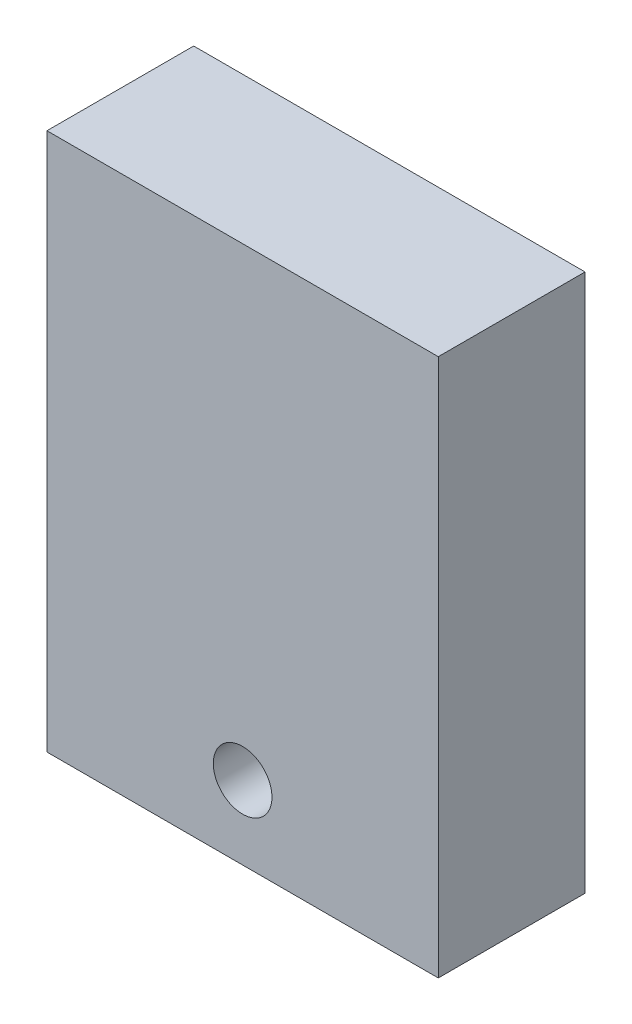
ISO-10303-21;
HEADER;
FILE_DESCRIPTION(('STEP AP214'),'2;1');
FILE_NAME('part.step','',(''),(''),'','','');
FILE_SCHEMA(('AUTOMOTIVE_DESIGN { 1 0 10303 214 1 1 1 1 }'));
ENDSEC;
DATA;
#1=APPLICATION_CONTEXT('core data for automotive mechanical design processes');
#2=APPLICATION_PROTOCOL_DEFINITION('international standard','automotive_design',2000,#1);
#3=PRODUCT_CONTEXT('',#1,'mechanical');
#4=PRODUCT('Part','Part','',(#3));
#5=PRODUCT_RELATED_PRODUCT_CATEGORY('part','',(#4));
#6=PRODUCT_DEFINITION_FORMATION('','',#4);
#7=PRODUCT_DEFINITION_CONTEXT('part definition',#1,'design');
#8=PRODUCT_DEFINITION('design','',#6,#7);
#9=PRODUCT_DEFINITION_SHAPE('','',#8);
#10=(LENGTH_UNIT() NAMED_UNIT(*) SI_UNIT(.MILLI.,.METRE.));
#11=(NAMED_UNIT(*) PLANE_ANGLE_UNIT() SI_UNIT($,.RADIAN.));
#12=(NAMED_UNIT(*) SI_UNIT($,.STERADIAN.) SOLID_ANGLE_UNIT());
#13=UNCERTAINTY_MEASURE_WITH_UNIT(LENGTH_MEASURE(1.E-05),#10,'distance_accuracy_value','');
#14=(GEOMETRIC_REPRESENTATION_CONTEXT(3) GLOBAL_UNCERTAINTY_ASSIGNED_CONTEXT((#13)) GLOBAL_UNIT_ASSIGNED_CONTEXT((#10,
#11,#12)) REPRESENTATION_CONTEXT('',''));
#15=CARTESIAN_POINT('',(0.,0.,0.));
#16=DIRECTION('',(0.,0.,1.));
#17=DIRECTION('',(1.,0.,0.));
#18=AXIS2_PLACEMENT_3D('',#15,#16,#17);
#19=CARTESIAN_POINT('',(0.,1.5,1.5));
#20=DIRECTION('',(0.,0.,-1.));
#21=DIRECTION('',(-1.,0.,0.));
#22=AXIS2_PLACEMENT_3D('',#19,#20,#21);
#23=CYLINDRICAL_SURFACE('',#22,0.6);
#24=CARTESIAN_POINT('',(0.,1.5,1.5));
#25=DIRECTION('',(0.,0.,-1.));
#26=DIRECTION('',(-1.,0.,0.));
#27=AXIS2_PLACEMENT_3D('',#24,#25,#26);
#28=CIRCLE('',#27,0.6);
#29=CARTESIAN_POINT('',(-0.6,1.5,1.5));
#30=VERTEX_POINT('',#29);
#31=EDGE_CURVE('E158',#30,#30,#28,.T.);
#32=ORIENTED_EDGE('',*,*,#31,.F.);
#33=EDGE_LOOP('',(#32));
#34=FACE_BOUND('',#33,.T.);
#35=CARTESIAN_POINT('',(0.,1.5,0.));
#36=DIRECTION('',(0.,0.,-1.));
#37=DIRECTION('',(-1.,0.,0.));
#38=AXIS2_PLACEMENT_3D('',#35,#36,#37);
#39=CIRCLE('',#38,0.6);
#40=CARTESIAN_POINT('',(-0.6,1.5,0.));
#41=VERTEX_POINT('',#40);
#42=EDGE_CURVE('E43',#41,#41,#39,.F.);
#43=ORIENTED_EDGE('',*,*,#42,.F.);
#44=EDGE_LOOP('',(#43));
#45=FACE_BOUND('',#44,.T.);
#46=ADVANCED_FACE('F39',(#34,#45),#23,.F.);
#47=CARTESIAN_POINT('',(-4.,3.,1.5));
#48=DIRECTION('',(-1.,0.,0.));
#49=DIRECTION('',(0.,0.,1.));
#50=AXIS2_PLACEMENT_3D('',#47,#48,#49);
#51=PLANE('',#50);
#52=DIRECTION('',(0.,0.,-1.));
#53=VECTOR('',#52,1.);
#54=CARTESIAN_POINT('',(-4.,0.,1.5));
#55=LINE('',#54,#53);
#56=CARTESIAN_POINT('',(-4.,0.,1.5));
#57=VERTEX_POINT('',#56);
#58=CARTESIAN_POINT('',(-4.,0.,-1.5));
#59=VERTEX_POINT('',#58);
#60=EDGE_CURVE('E108',#57,#59,#55,.T.);
#61=ORIENTED_EDGE('',*,*,#60,.F.);
#62=DIRECTION('',(0.,-1.,0.));
#63=VECTOR('',#62,1.);
#64=CARTESIAN_POINT('',(-4.,3.,1.5));
#65=LINE('',#64,#63);
#66=CARTESIAN_POINT('',(-4.,11.,1.5));
#67=VERTEX_POINT('',#66);
#68=EDGE_CURVE('E11',#67,#57,#65,.T.);
#69=ORIENTED_EDGE('',*,*,#68,.F.);
#70=DIRECTION('',(0.,0.,-1.));
#71=VECTOR('',#70,1.);
#72=CARTESIAN_POINT('',(-4.,11.,12.8137084989848));
#73=LINE('',#72,#71);
#74=CARTESIAN_POINT('',(-4.,11.,-1.5));
#75=VERTEX_POINT('',#74);
#76=EDGE_CURVE('E90',#67,#75,#73,.T.);
#77=ORIENTED_EDGE('',*,*,#76,.T.);
#78=DIRECTION('',(0.,-1.,0.));
#79=VECTOR('',#78,1.);
#80=CARTESIAN_POINT('',(-4.,3.,-1.5));
#81=LINE('',#80,#79);
#82=EDGE_CURVE('E78',#75,#59,#81,.T.);
#83=ORIENTED_EDGE('',*,*,#82,.T.);
#84=EDGE_LOOP('',(#61,#69,#77,#83));
#85=FACE_BOUND('',#84,.T.);
#86=ADVANCED_FACE('F41',(#85),#51,.T.);
#87=CARTESIAN_POINT('',(-4.,3.,1.5));
#88=DIRECTION('',(0.,0.,-1.));
#89=DIRECTION('',(-1.,0.,0.));
#90=AXIS2_PLACEMENT_3D('',#87,#88,#89);
#91=PLANE('',#90);
#92=ORIENTED_EDGE('',*,*,#31,.T.);
#93=EDGE_LOOP('',(#92));
#94=FACE_BOUND('',#93,.T.);
#95=DIRECTION('',(1.,0.,0.));
#96=VECTOR('',#95,1.);
#97=CARTESIAN_POINT('',(-4.,0.,1.5));
#98=LINE('',#97,#96);
#99=CARTESIAN_POINT('',(4.,0.,1.5));
#100=VERTEX_POINT('',#99);
#101=EDGE_CURVE('E58',#57,#100,#98,.T.);
#102=ORIENTED_EDGE('',*,*,#101,.T.);
#103=DIRECTION('',(0.,-1.,0.));
#104=VECTOR('',#103,1.);
#105=CARTESIAN_POINT('',(4.,3.,1.5));
#106=LINE('',#105,#104);
#107=CARTESIAN_POINT('',(4.,11.,1.5));
#108=VERTEX_POINT('',#107);
#109=EDGE_CURVE('E48',#108,#100,#106,.T.);
#110=ORIENTED_EDGE('',*,*,#109,.F.);
#111=DIRECTION('',(1.,0.,0.));
#112=VECTOR('',#111,1.);
#113=CARTESIAN_POINT('',(4.,11.,1.5));
#114=LINE('',#113,#112);
#115=EDGE_CURVE('E105',#67,#108,#114,.T.);
#116=ORIENTED_EDGE('',*,*,#115,.F.);
#117=ORIENTED_EDGE('',*,*,#68,.T.);
#118=EDGE_LOOP('',(#102,#110,#116,#117));
#119=FACE_BOUND('',#118,.T.);
#120=ADVANCED_FACE('F137',(#94,#119),#91,.F.);
#121=CARTESIAN_POINT('',(4.,3.,1.5));
#122=DIRECTION('',(-1.,0.,0.));
#123=DIRECTION('',(0.,0.,1.));
#124=AXIS2_PLACEMENT_3D('',#121,#122,#123);
#125=PLANE('',#124);
#126=DIRECTION('',(0.,0.,-1.));
#127=VECTOR('',#126,1.);
#128=CARTESIAN_POINT('',(4.,0.,1.5));
#129=LINE('',#128,#127);
#130=CARTESIAN_POINT('',(4.,0.,-1.5));
#131=VERTEX_POINT('',#130);
#132=EDGE_CURVE('E111',#100,#131,#129,.T.);
#133=ORIENTED_EDGE('',*,*,#132,.T.);
#134=DIRECTION('',(0.,-1.,0.));
#135=VECTOR('',#134,1.);
#136=CARTESIAN_POINT('',(4.,3.,-1.5));
#137=LINE('',#136,#135);
#138=CARTESIAN_POINT('',(4.,11.,-1.5));
#139=VERTEX_POINT('',#138);
#140=EDGE_CURVE('E88',#139,#131,#137,.T.);
#141=ORIENTED_EDGE('',*,*,#140,.F.);
#142=DIRECTION('',(0.,0.,-1.));
#143=VECTOR('',#142,1.);
#144=CARTESIAN_POINT('',(4.,11.,12.8137084989848));
#145=LINE('',#144,#143);
#146=EDGE_CURVE('E93',#108,#139,#145,.T.);
#147=ORIENTED_EDGE('',*,*,#146,.F.);
#148=ORIENTED_EDGE('',*,*,#109,.T.);
#149=EDGE_LOOP('',(#133,#141,#147,#148));
#150=FACE_BOUND('',#149,.T.);
#151=ADVANCED_FACE('F118',(#150),#125,.F.);
#152=CARTESIAN_POINT('',(-4.,3.,-1.5));
#153=DIRECTION('',(0.,0.,-1.));
#154=DIRECTION('',(-1.,0.,0.));
#155=AXIS2_PLACEMENT_3D('',#152,#153,#154);
#156=PLANE('',#155);
#157=CARTESIAN_POINT('',(0.,1.5,-1.5));
#158=DIRECTION('',(0.,0.,-1.));
#159=DIRECTION('',(-1.,0.,0.));
#160=AXIS2_PLACEMENT_3D('',#157,#158,#159);
#161=CIRCLE('',#160,1.);
#162=CARTESIAN_POINT('',(-1.,1.5,-1.5));
#163=VERTEX_POINT('',#162);
#164=EDGE_CURVE('E162',#163,#163,#161,.T.);
#165=ORIENTED_EDGE('',*,*,#164,.F.);
#166=EDGE_LOOP('',(#165));
#167=FACE_BOUND('',#166,.T.);
#168=CARTESIAN_POINT('',(0.,7.,-1.5));
#169=DIRECTION('',(0.,0.,-1.));
#170=DIRECTION('',(-1.,0.,0.));
#171=AXIS2_PLACEMENT_3D('',#168,#169,#170);
#172=CIRCLE('',#171,2.6);
#173=CARTESIAN_POINT('',(-2.6,7.,-1.5));
#174=VERTEX_POINT('',#173);
#175=EDGE_CURVE('E101',#174,#174,#172,.T.);
#176=ORIENTED_EDGE('',*,*,#175,.F.);
#177=EDGE_LOOP('',(#176));
#178=FACE_BOUND('',#177,.T.);
#179=DIRECTION('',(1.,0.,0.));
#180=VECTOR('',#179,1.);
#181=CARTESIAN_POINT('',(-4.,0.,-1.5));
#182=LINE('',#181,#180);
#183=EDGE_CURVE('E84',#59,#131,#182,.T.);
#184=ORIENTED_EDGE('',*,*,#183,.F.);
#185=ORIENTED_EDGE('',*,*,#82,.F.);
#186=DIRECTION('',(-1.,0.,0.));
#187=VECTOR('',#186,1.);
#188=CARTESIAN_POINT('',(4.,11.,-1.5));
#189=LINE('',#188,#187);
#190=EDGE_CURVE('E82',#139,#75,#189,.T.);
#191=ORIENTED_EDGE('',*,*,#190,.F.);
#192=ORIENTED_EDGE('',*,*,#140,.T.);
#193=EDGE_LOOP('',(#184,#185,#191,#192));
#194=FACE_BOUND('',#193,.T.);
#195=ADVANCED_FACE('F80',(#167,#178,#194),#156,.T.);
#196=CARTESIAN_POINT('',(0.,0.,0.));
#197=DIRECTION('',(0.,-1.,0.));
#198=DIRECTION('',(0.,0.,-1.));
#199=AXIS2_PLACEMENT_3D('',#196,#197,#198);
#200=PLANE('',#199);
#201=ORIENTED_EDGE('',*,*,#60,.T.);
#202=ORIENTED_EDGE('',*,*,#183,.T.);
#203=ORIENTED_EDGE('',*,*,#132,.F.);
#204=ORIENTED_EDGE('',*,*,#101,.F.);
#205=EDGE_LOOP('',(#201,#202,#203,#204));
#206=FACE_BOUND('',#205,.T.);
#207=ADVANCED_FACE('F120',(#206),#200,.T.);
#208=CARTESIAN_POINT('',(4.,11.,12.8137084989848));
#209=DIRECTION('',(0.,-1.,0.));
#210=DIRECTION('',(0.,0.,-1.));
#211=AXIS2_PLACEMENT_3D('',#208,#209,#210);
#212=PLANE('',#211);
#213=ORIENTED_EDGE('',*,*,#76,.F.);
#214=ORIENTED_EDGE('',*,*,#115,.T.);
#215=ORIENTED_EDGE('',*,*,#146,.T.);
#216=ORIENTED_EDGE('',*,*,#190,.T.);
#217=EDGE_LOOP('',(#213,#214,#215,#216));
#218=FACE_BOUND('',#217,.T.);
#219=ADVANCED_FACE('F96',(#218),#212,.F.);
#220=CARTESIAN_POINT('',(0.,7.,-0.699999999999999));
#221=DIRECTION('',(0.,0.,-1.));
#222=DIRECTION('',(-1.,0.,0.));
#223=AXIS2_PLACEMENT_3D('',#220,#221,#222);
#224=CYLINDRICAL_SURFACE('',#223,2.6);
#225=CARTESIAN_POINT('',(0.,7.,-0.699999999999999));
#226=DIRECTION('',(0.,0.,-1.));
#227=DIRECTION('',(-1.,0.,0.));
#228=AXIS2_PLACEMENT_3D('',#225,#226,#227);
#229=CIRCLE('',#228,2.6);
#230=CARTESIAN_POINT('',(-2.6,7.,-0.699999999999999));
#231=VERTEX_POINT('',#230);
#232=EDGE_CURVE('E98',#231,#231,#229,.T.);
#233=ORIENTED_EDGE('',*,*,#232,.F.);
#234=EDGE_LOOP('',(#233));
#235=FACE_BOUND('',#234,.T.);
#236=ORIENTED_EDGE('',*,*,#175,.T.);
#237=EDGE_LOOP('',(#236));
#238=FACE_BOUND('',#237,.T.);
#239=ADVANCED_FACE('F127',(#235,#238),#224,.F.);
#240=CARTESIAN_POINT('',(0.,7.,-0.699999999999999));
#241=DIRECTION('',(0.,0.,-1.));
#242=DIRECTION('',(-1.,0.,0.));
#243=AXIS2_PLACEMENT_3D('',#240,#241,#242);
#244=PLANE('',#243);
#245=ORIENTED_EDGE('',*,*,#232,.T.);
#246=EDGE_LOOP('',(#245));
#247=FACE_BOUND('',#246,.T.);
#248=ADVANCED_FACE('F144',(#247),#244,.T.);
#249=CARTESIAN_POINT('',(0.,1.5,0.));
#250=DIRECTION('',(0.,0.,-1.));
#251=DIRECTION('',(-1.,0.,0.));
#252=AXIS2_PLACEMENT_3D('',#249,#250,#251);
#253=PLANE('',#252);
#254=CARTESIAN_POINT('',(0.,1.5,0.));
#255=DIRECTION('',(0.,0.,-1.));
#256=DIRECTION('',(-1.,0.,0.));
#257=AXIS2_PLACEMENT_3D('',#254,#255,#256);
#258=CIRCLE('',#257,1.);
#259=CARTESIAN_POINT('',(-1.,1.5,0.));
#260=VERTEX_POINT('',#259);
#261=EDGE_CURVE('E165',#260,#260,#258,.T.);
#262=ORIENTED_EDGE('',*,*,#261,.T.);
#263=EDGE_LOOP('',(#262));
#264=FACE_BOUND('',#263,.T.);
#265=ORIENTED_EDGE('',*,*,#42,.T.);
#266=EDGE_LOOP('',(#265));
#267=FACE_BOUND('',#266,.T.);
#268=ADVANCED_FACE('F147',(#264,#267),#253,.T.);
#269=CARTESIAN_POINT('',(0.,1.5,0.));
#270=DIRECTION('',(0.,0.,-1.));
#271=DIRECTION('',(-1.,0.,0.));
#272=AXIS2_PLACEMENT_3D('',#269,#270,#271);
#273=CYLINDRICAL_SURFACE('',#272,1.);
#274=ORIENTED_EDGE('',*,*,#261,.F.);
#275=EDGE_LOOP('',(#274));
#276=FACE_BOUND('',#275,.T.);
#277=ORIENTED_EDGE('',*,*,#164,.T.);
#278=EDGE_LOOP('',(#277));
#279=FACE_BOUND('',#278,.T.);
#280=ADVANCED_FACE('F142',(#276,#279),#273,.F.);
#281=CLOSED_SHELL('',(#46,#86,#120,#151,#195,#207,#219,#239,#248,#268,#280));
#282=MANIFOLD_SOLID_BREP('B2',#281);
#283=ADVANCED_BREP_SHAPE_REPRESENTATION('',(#18,#282),#14);
#284=SHAPE_DEFINITION_REPRESENTATION(#9,#283);
ENDSEC;
END-ISO-10303-21;
